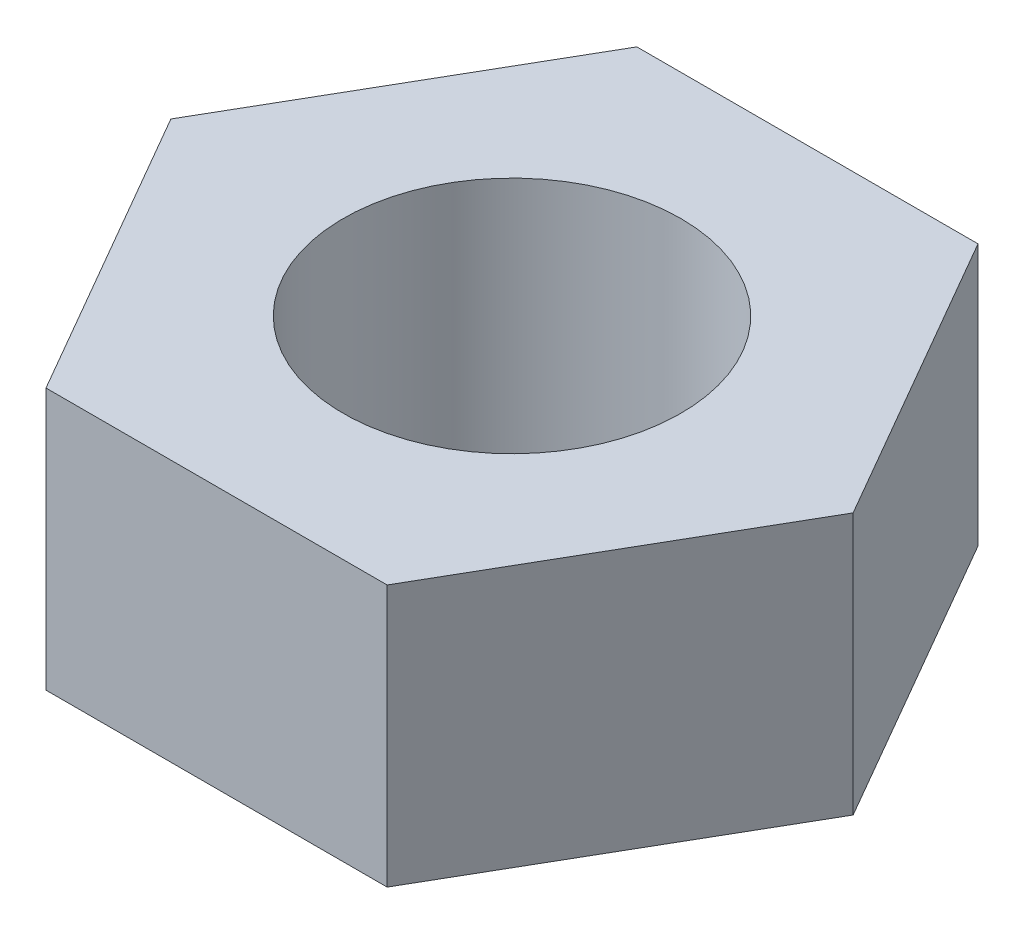
ISO-10303-21;
HEADER;
FILE_DESCRIPTION(('STEP AP214'),'2;1');
FILE_NAME('part.step','',(''),(''),'','','');
FILE_SCHEMA(('AUTOMOTIVE_DESIGN { 1 0 10303 214 1 1 1 1 }'));
ENDSEC;
DATA;
#1=APPLICATION_CONTEXT('core data for automotive mechanical design processes');
#2=APPLICATION_PROTOCOL_DEFINITION('international standard','automotive_design',2000,#1);
#3=PRODUCT_CONTEXT('',#1,'mechanical');
#4=PRODUCT('Part','Part','',(#3));
#5=PRODUCT_RELATED_PRODUCT_CATEGORY('part','',(#4));
#6=PRODUCT_DEFINITION_FORMATION('','',#4);
#7=PRODUCT_DEFINITION_CONTEXT('part definition',#1,'design');
#8=PRODUCT_DEFINITION('design','',#6,#7);
#9=PRODUCT_DEFINITION_SHAPE('','',#8);
#10=(LENGTH_UNIT() NAMED_UNIT(*) SI_UNIT(.MILLI.,.METRE.));
#11=(NAMED_UNIT(*) PLANE_ANGLE_UNIT() SI_UNIT($,.RADIAN.));
#12=(NAMED_UNIT(*) SI_UNIT($,.STERADIAN.) SOLID_ANGLE_UNIT());
#13=UNCERTAINTY_MEASURE_WITH_UNIT(LENGTH_MEASURE(1.E-05),#10,'distance_accuracy_value','');
#14=(GEOMETRIC_REPRESENTATION_CONTEXT(3) GLOBAL_UNCERTAINTY_ASSIGNED_CONTEXT((#13)) GLOBAL_UNIT_ASSIGNED_CONTEXT((#10,
#11,#12)) REPRESENTATION_CONTEXT('',''));
#15=CARTESIAN_POINT('',(0.,0.,0.));
#16=DIRECTION('',(0.,0.,1.));
#17=DIRECTION('',(1.,0.,0.));
#18=AXIS2_PLACEMENT_3D('',#15,#16,#17);
#19=CARTESIAN_POINT('',(2.02072594216369,3.1,3.5));
#20=DIRECTION('',(-0.866025403784439,0.,-0.5));
#21=DIRECTION('',(-0.5,0.,0.866025403784439));
#22=AXIS2_PLACEMENT_3D('',#19,#20,#21);
#23=PLANE('',#22);
#24=DIRECTION('',(0.5,0.,-0.866025403784439));
#25=VECTOR('',#24,1.);
#26=CARTESIAN_POINT('',(2.02072594216369,0.,3.5));
#27=LINE('',#26,#25);
#28=CARTESIAN_POINT('',(2.02072594216369,0.,3.5));
#29=VERTEX_POINT('',#28);
#30=CARTESIAN_POINT('',(4.04145188432738,0.,0.));
#31=VERTEX_POINT('',#30);
#32=EDGE_CURVE('E132',#29,#31,#27,.T.);
#33=ORIENTED_EDGE('',*,*,#32,.T.);
#34=DIRECTION('',(0.,-1.,0.));
#35=VECTOR('',#34,1.);
#36=CARTESIAN_POINT('',(4.04145188432738,3.1,0.));
#37=LINE('',#36,#35);
#38=CARTESIAN_POINT('',(4.04145188432738,3.1,0.));
#39=VERTEX_POINT('',#38);
#40=EDGE_CURVE('E11',#39,#31,#37,.T.);
#41=ORIENTED_EDGE('',*,*,#40,.F.);
#42=DIRECTION('',(0.5,0.,-0.866025403784439));
#43=VECTOR('',#42,1.);
#44=CARTESIAN_POINT('',(2.02072594216369,3.1,3.5));
#45=LINE('',#44,#43);
#46=CARTESIAN_POINT('',(2.02072594216369,3.1,3.5));
#47=VERTEX_POINT('',#46);
#48=EDGE_CURVE('E149',#47,#39,#45,.T.);
#49=ORIENTED_EDGE('',*,*,#48,.F.);
#50=DIRECTION('',(0.,-1.,0.));
#51=VECTOR('',#50,1.);
#52=CARTESIAN_POINT('',(2.02072594216369,3.1,3.5));
#53=LINE('',#52,#51);
#54=EDGE_CURVE('E128',#47,#29,#53,.T.);
#55=ORIENTED_EDGE('',*,*,#54,.T.);
#56=EDGE_LOOP('',(#33,#41,#49,#55));
#57=FACE_BOUND('',#56,.T.);
#58=ADVANCED_FACE('F43',(#57),#23,.F.);
#59=CARTESIAN_POINT('',(4.04145188432738,3.1,0.));
#60=DIRECTION('',(-0.866025403784438,0.,0.5));
#61=DIRECTION('',(0.5,0.,0.866025403784439));
#62=AXIS2_PLACEMENT_3D('',#59,#60,#61);
#63=PLANE('',#62);
#64=DIRECTION('',(-0.5,0.,-0.866025403784438));
#65=VECTOR('',#64,1.);
#66=CARTESIAN_POINT('',(4.04145188432738,0.,0.));
#67=LINE('',#66,#65);
#68=CARTESIAN_POINT('',(2.02072594216369,0.,-3.5));
#69=VERTEX_POINT('',#68);
#70=EDGE_CURVE('E136',#31,#69,#67,.T.);
#71=ORIENTED_EDGE('',*,*,#70,.T.);
#72=DIRECTION('',(0.,-1.,0.));
#73=VECTOR('',#72,1.);
#74=CARTESIAN_POINT('',(2.02072594216369,3.1,-3.5));
#75=LINE('',#74,#73);
#76=CARTESIAN_POINT('',(2.02072594216369,3.1,-3.5));
#77=VERTEX_POINT('',#76);
#78=EDGE_CURVE('E52',#77,#69,#75,.T.);
#79=ORIENTED_EDGE('',*,*,#78,.F.);
#80=DIRECTION('',(-0.5,0.,-0.866025403784438));
#81=VECTOR('',#80,1.);
#82=CARTESIAN_POINT('',(4.04145188432738,3.1,0.));
#83=LINE('',#82,#81);
#84=EDGE_CURVE('E97',#39,#77,#83,.T.);
#85=ORIENTED_EDGE('',*,*,#84,.F.);
#86=ORIENTED_EDGE('',*,*,#40,.T.);
#87=EDGE_LOOP('',(#71,#79,#85,#86));
#88=FACE_BOUND('',#87,.T.);
#89=ADVANCED_FACE('F178',(#88),#63,.F.);
#90=CARTESIAN_POINT('',(2.02072594216369,3.1,-3.5));
#91=DIRECTION('',(0.,0.,1.));
#92=DIRECTION('',(1.,0.,0.));
#93=AXIS2_PLACEMENT_3D('',#90,#91,#92);
#94=PLANE('',#93);
#95=DIRECTION('',(-1.,0.,0.));
#96=VECTOR('',#95,1.);
#97=CARTESIAN_POINT('',(2.02072594216369,0.,-3.5));
#98=LINE('',#97,#96);
#99=CARTESIAN_POINT('',(-2.02072594216369,0.,-3.5));
#100=VERTEX_POINT('',#99);
#101=EDGE_CURVE('E140',#69,#100,#98,.T.);
#102=ORIENTED_EDGE('',*,*,#101,.T.);
#103=DIRECTION('',(0.,-1.,0.));
#104=VECTOR('',#103,1.);
#105=CARTESIAN_POINT('',(-2.02072594216369,3.1,-3.5));
#106=LINE('',#105,#104);
#107=CARTESIAN_POINT('',(-2.02072594216369,3.1,-3.5));
#108=VERTEX_POINT('',#107);
#109=EDGE_CURVE('E121',#108,#100,#106,.T.);
#110=ORIENTED_EDGE('',*,*,#109,.F.);
#111=DIRECTION('',(-1.,0.,0.));
#112=VECTOR('',#111,1.);
#113=CARTESIAN_POINT('',(2.02072594216369,3.1,-3.5));
#114=LINE('',#113,#112);
#115=EDGE_CURVE('E110',#77,#108,#114,.T.);
#116=ORIENTED_EDGE('',*,*,#115,.F.);
#117=ORIENTED_EDGE('',*,*,#78,.T.);
#118=EDGE_LOOP('',(#102,#110,#116,#117));
#119=FACE_BOUND('',#118,.T.);
#120=ADVANCED_FACE('F159',(#119),#94,.F.);
#121=CARTESIAN_POINT('',(-2.02072594216369,3.1,-3.5));
#122=DIRECTION('',(0.866025403784438,0.,0.5));
#123=DIRECTION('',(0.5,0.,-0.866025403784439));
#124=AXIS2_PLACEMENT_3D('',#121,#122,#123);
#125=PLANE('',#124);
#126=DIRECTION('',(-0.5,0.,0.866025403784439));
#127=VECTOR('',#126,1.);
#128=CARTESIAN_POINT('',(-2.02072594216369,0.,-3.5));
#129=LINE('',#128,#127);
#130=CARTESIAN_POINT('',(-4.04145188432738,0.,0.));
#131=VERTEX_POINT('',#130);
#132=EDGE_CURVE('E119',#100,#131,#129,.T.);
#133=ORIENTED_EDGE('',*,*,#132,.T.);
#134=DIRECTION('',(0.,-1.,0.));
#135=VECTOR('',#134,1.);
#136=CARTESIAN_POINT('',(-4.04145188432738,3.1,0.));
#137=LINE('',#136,#135);
#138=CARTESIAN_POINT('',(-4.04145188432738,3.1,0.));
#139=VERTEX_POINT('',#138);
#140=EDGE_CURVE('E116',#139,#131,#137,.T.);
#141=ORIENTED_EDGE('',*,*,#140,.F.);
#142=DIRECTION('',(-0.5,0.,0.866025403784439));
#143=VECTOR('',#142,1.);
#144=CARTESIAN_POINT('',(-2.02072594216369,3.1,-3.5));
#145=LINE('',#144,#143);
#146=EDGE_CURVE('E104',#108,#139,#145,.T.);
#147=ORIENTED_EDGE('',*,*,#146,.F.);
#148=ORIENTED_EDGE('',*,*,#109,.T.);
#149=EDGE_LOOP('',(#133,#141,#147,#148));
#150=FACE_BOUND('',#149,.T.);
#151=ADVANCED_FACE('F117',(#150),#125,.F.);
#152=CARTESIAN_POINT('',(-4.04145188432738,3.1,0.));
#153=DIRECTION('',(0.866025403784438,0.,-0.5));
#154=DIRECTION('',(-0.5,0.,-0.866025403784439));
#155=AXIS2_PLACEMENT_3D('',#152,#153,#154);
#156=PLANE('',#155);
#157=DIRECTION('',(0.5,0.,0.866025403784439));
#158=VECTOR('',#157,1.);
#159=CARTESIAN_POINT('',(-4.04145188432738,0.,0.));
#160=LINE('',#159,#158);
#161=CARTESIAN_POINT('',(-2.02072594216369,0.,3.5));
#162=VERTEX_POINT('',#161);
#163=EDGE_CURVE('E83',#131,#162,#160,.T.);
#164=ORIENTED_EDGE('',*,*,#163,.T.);
#165=DIRECTION('',(0.,-1.,0.));
#166=VECTOR('',#165,1.);
#167=CARTESIAN_POINT('',(-2.02072594216369,3.1,3.5));
#168=LINE('',#167,#166);
#169=CARTESIAN_POINT('',(-2.02072594216369,3.1,3.5));
#170=VERTEX_POINT('',#169);
#171=EDGE_CURVE('E122',#170,#162,#168,.T.);
#172=ORIENTED_EDGE('',*,*,#171,.F.);
#173=DIRECTION('',(0.5,0.,0.866025403784439));
#174=VECTOR('',#173,1.);
#175=CARTESIAN_POINT('',(-4.04145188432738,3.1,0.));
#176=LINE('',#175,#174);
#177=EDGE_CURVE('E108',#139,#170,#176,.T.);
#178=ORIENTED_EDGE('',*,*,#177,.F.);
#179=ORIENTED_EDGE('',*,*,#140,.T.);
#180=EDGE_LOOP('',(#164,#172,#178,#179));
#181=FACE_BOUND('',#180,.T.);
#182=ADVANCED_FACE('F124',(#181),#156,.F.);
#183=CARTESIAN_POINT('',(-2.02072594216369,3.1,3.5));
#184=DIRECTION('',(0.,0.,-1.));
#185=DIRECTION('',(-1.,0.,0.));
#186=AXIS2_PLACEMENT_3D('',#183,#184,#185);
#187=PLANE('',#186);
#188=DIRECTION('',(1.,0.,0.));
#189=VECTOR('',#188,1.);
#190=CARTESIAN_POINT('',(-2.02072594216369,0.,3.5));
#191=LINE('',#190,#189);
#192=EDGE_CURVE('E89',#162,#29,#191,.T.);
#193=ORIENTED_EDGE('',*,*,#192,.T.);
#194=ORIENTED_EDGE('',*,*,#54,.F.);
#195=DIRECTION('',(1.,0.,0.));
#196=VECTOR('',#195,1.);
#197=CARTESIAN_POINT('',(-2.02072594216369,3.1,3.5));
#198=LINE('',#197,#196);
#199=EDGE_CURVE('E60',#170,#47,#198,.T.);
#200=ORIENTED_EDGE('',*,*,#199,.F.);
#201=ORIENTED_EDGE('',*,*,#171,.T.);
#202=EDGE_LOOP('',(#193,#194,#200,#201));
#203=FACE_BOUND('',#202,.T.);
#204=ADVANCED_FACE('F166',(#203),#187,.F.);
#205=CARTESIAN_POINT('',(0.,3.1,0.));
#206=DIRECTION('',(0.,1.,0.));
#207=DIRECTION('',(0.,0.,1.));
#208=AXIS2_PLACEMENT_3D('',#205,#206,#207);
#209=PLANE('',#208);
#210=CARTESIAN_POINT('',(0.,3.1,0.));
#211=DIRECTION('',(0.,-1.,0.));
#212=DIRECTION('',(0.,0.,-1.));
#213=AXIS2_PLACEMENT_3D('',#210,#211,#212);
#214=CIRCLE('',#213,2.);
#215=CARTESIAN_POINT('',(0.,3.1,-2.));
#216=VERTEX_POINT('',#215);
#217=EDGE_CURVE('E137',#216,#216,#214,.T.);
#218=ORIENTED_EDGE('',*,*,#217,.T.);
#219=EDGE_LOOP('',(#218));
#220=FACE_BOUND('',#219,.T.);
#221=ORIENTED_EDGE('',*,*,#48,.T.);
#222=ORIENTED_EDGE('',*,*,#84,.T.);
#223=ORIENTED_EDGE('',*,*,#115,.T.);
#224=ORIENTED_EDGE('',*,*,#146,.T.);
#225=ORIENTED_EDGE('',*,*,#177,.T.);
#226=ORIENTED_EDGE('',*,*,#199,.T.);
#227=EDGE_LOOP('',(#221,#222,#223,#224,#225,#226));
#228=FACE_BOUND('',#227,.T.);
#229=ADVANCED_FACE('F106',(#220,#228),#209,.T.);
#230=CARTESIAN_POINT('',(0.,0.,0.));
#231=DIRECTION('',(0.,1.,0.));
#232=DIRECTION('',(0.,0.,1.));
#233=AXIS2_PLACEMENT_3D('',#230,#231,#232);
#234=PLANE('',#233);
#235=CARTESIAN_POINT('',(0.,0.,0.));
#236=DIRECTION('',(0.,-1.,0.));
#237=DIRECTION('',(0.,0.,-1.));
#238=AXIS2_PLACEMENT_3D('',#235,#236,#237);
#239=CIRCLE('',#238,2.);
#240=CARTESIAN_POINT('',(0.,0.,-2.));
#241=VERTEX_POINT('',#240);
#242=EDGE_CURVE('E265',#241,#241,#239,.T.);
#243=ORIENTED_EDGE('',*,*,#242,.F.);
#244=EDGE_LOOP('',(#243));
#245=FACE_BOUND('',#244,.T.);
#246=ORIENTED_EDGE('',*,*,#32,.F.);
#247=ORIENTED_EDGE('',*,*,#192,.F.);
#248=ORIENTED_EDGE('',*,*,#163,.F.);
#249=ORIENTED_EDGE('',*,*,#132,.F.);
#250=ORIENTED_EDGE('',*,*,#101,.F.);
#251=ORIENTED_EDGE('',*,*,#70,.F.);
#252=EDGE_LOOP('',(#246,#247,#248,#249,#250,#251));
#253=FACE_BOUND('',#252,.T.);
#254=ADVANCED_FACE('F162',(#245,#253),#234,.F.);
#255=CARTESIAN_POINT('',(0.,3.1,0.));
#256=DIRECTION('',(0.,-1.,0.));
#257=DIRECTION('',(0.,0.,-1.));
#258=AXIS2_PLACEMENT_3D('',#255,#256,#257);
#259=CYLINDRICAL_SURFACE('',#258,2.);
#260=CARTESIAN_POINT('',(0.,3.1,-2.));
#261=CARTESIAN_POINT('',(0.,3.06770833333333,-2.));
#262=CARTESIAN_POINT('',(0.,3.03541666666667,-2.));
#263=CARTESIAN_POINT('',(0.,2.97083333333333,-2.));
#264=CARTESIAN_POINT('',(0.,2.93854166666667,-2.));
#265=CARTESIAN_POINT('',(0.,2.87395833333333,-2.));
#266=CARTESIAN_POINT('',(0.,2.84166666666667,-2.));
#267=CARTESIAN_POINT('',(0.,2.77708333333333,-2.));
#268=CARTESIAN_POINT('',(0.,2.74479166666667,-2.));
#269=CARTESIAN_POINT('',(0.,2.68020833333333,-2.));
#270=CARTESIAN_POINT('',(0.,2.64791666666667,-2.));
#271=CARTESIAN_POINT('',(0.,2.58333333333333,-2.));
#272=CARTESIAN_POINT('',(0.,2.55104166666667,-2.));
#273=CARTESIAN_POINT('',(0.,2.48645833333333,-2.));
#274=CARTESIAN_POINT('',(0.,2.45416666666667,-2.));
#275=CARTESIAN_POINT('',(0.,2.38958333333333,-2.));
#276=CARTESIAN_POINT('',(0.,2.35729166666667,-2.));
#277=CARTESIAN_POINT('',(0.,2.29270833333333,-2.));
#278=CARTESIAN_POINT('',(0.,2.26041666666667,-2.));
#279=CARTESIAN_POINT('',(0.,2.19583333333333,-2.));
#280=CARTESIAN_POINT('',(0.,2.16354166666667,-2.));
#281=CARTESIAN_POINT('',(0.,2.09895833333333,-2.));
#282=CARTESIAN_POINT('',(0.,2.06666666666667,-2.));
#283=CARTESIAN_POINT('',(0.,2.00208333333333,-2.));
#284=CARTESIAN_POINT('',(0.,1.96979166666667,-2.));
#285=CARTESIAN_POINT('',(0.,1.90520833333333,-2.));
#286=CARTESIAN_POINT('',(0.,1.87291666666667,-2.));
#287=CARTESIAN_POINT('',(0.,1.80833333333333,-2.));
#288=CARTESIAN_POINT('',(0.,1.77604166666667,-2.));
#289=CARTESIAN_POINT('',(0.,1.71145833333333,-2.));
#290=CARTESIAN_POINT('',(0.,1.67916666666667,-2.));
#291=CARTESIAN_POINT('',(0.,1.61458333333333,-2.));
#292=CARTESIAN_POINT('',(0.,1.58229166666667,-2.));
#293=CARTESIAN_POINT('',(0.,1.51770833333333,-2.));
#294=CARTESIAN_POINT('',(0.,1.48541666666667,-2.));
#295=CARTESIAN_POINT('',(0.,1.42083333333333,-2.));
#296=CARTESIAN_POINT('',(0.,1.38854166666667,-2.));
#297=CARTESIAN_POINT('',(0.,1.32395833333333,-2.));
#298=CARTESIAN_POINT('',(0.,1.29166666666667,-2.));
#299=CARTESIAN_POINT('',(0.,1.22708333333333,-2.));
#300=CARTESIAN_POINT('',(0.,1.19479166666667,-2.));
#301=CARTESIAN_POINT('',(0.,1.13020833333333,-2.));
#302=CARTESIAN_POINT('',(0.,1.09791666666667,-2.));
#303=CARTESIAN_POINT('',(0.,1.03333333333333,-2.));
#304=CARTESIAN_POINT('',(0.,1.00104166666667,-2.));
#305=CARTESIAN_POINT('',(0.,0.936458333333333,-2.));
#306=CARTESIAN_POINT('',(0.,0.904166666666667,-2.));
#307=CARTESIAN_POINT('',(0.,0.839583333333334,-2.));
#308=CARTESIAN_POINT('',(0.,0.807291666666667,-2.));
#309=CARTESIAN_POINT('',(0.,0.742708333333333,-2.));
#310=CARTESIAN_POINT('',(0.,0.710416666666667,-2.));
#311=CARTESIAN_POINT('',(0.,0.645833333333333,-2.));
#312=CARTESIAN_POINT('',(0.,0.613541666666667,-2.));
#313=CARTESIAN_POINT('',(0.,0.548958333333333,-2.));
#314=CARTESIAN_POINT('',(0.,0.516666666666667,-2.));
#315=CARTESIAN_POINT('',(0.,0.452083333333333,-2.));
#316=CARTESIAN_POINT('',(0.,0.419791666666667,-2.));
#317=CARTESIAN_POINT('',(0.,0.355208333333333,-2.));
#318=CARTESIAN_POINT('',(0.,0.322916666666667,-2.));
#319=CARTESIAN_POINT('',(0.,0.258333333333333,-2.));
#320=CARTESIAN_POINT('',(0.,0.226041666666667,-2.));
#321=CARTESIAN_POINT('',(0.,0.161458333333333,-2.));
#322=CARTESIAN_POINT('',(0.,0.129166666666667,-2.));
#323=CARTESIAN_POINT('',(0.,0.0645833333333335,-2.));
#324=CARTESIAN_POINT('',(0.,0.0322916666666667,-2.));
#325=CARTESIAN_POINT('',(0.,0.,-2.));
#326=B_SPLINE_CURVE_WITH_KNOTS('',3,(#260,#261,#262,#263,#264,#265,#266,#267,#268,#269,#270,
#271,#272,#273,#274,#275,#276,#277,#278,#279,#280,#281,#282,#283,#284,#285,#286,#287,#288,#289,
#290,#291,#292,#293,#294,#295,#296,#297,#298,#299,#300,#301,#302,#303,#304,#305,#306,#307,#308,
#309,#310,#311,#312,#313,#314,#315,#316,#317,#318,#319,#320,#321,#322,#323,#324,#325),
.UNSPECIFIED.,.F.,.F.,(4,2,2,2,2,2,2,2,2,2,2,2,2,2,2,2,2,2,2,2,2,2,2,2,2,2,2,2,2,2,2,2,4),(0.,
0.0968749999999997,0.19375,0.290625,0.3875,0.484375,0.58125,0.678125,0.775,0.871875,0.96875,
1.065625,1.1625,1.259375,1.35625,1.453125,1.55,1.646875,1.74375,1.840625,1.9375,2.034375,
2.13125,2.228125,2.325,2.421875,2.51875,2.615625,2.7125,2.809375,2.90625,3.003125,3.1),.UNSPECIFIED.);
#327=EDGE_CURVE('BSEAM218',#216,#241,#326,.T.);
#328=ORIENTED_EDGE('',*,*,#217,.F.);
#329=ORIENTED_EDGE('',*,*,#242,.T.);
#330=ORIENTED_EDGE('',*,*,#327,.T.);
#331=ORIENTED_EDGE('',*,*,#327,.F.);
#332=EDGE_LOOP('',(#328,#330,#329,#331));
#333=FACE_BOUND('',#332,.T.);
#334=ADVANCED_FACE('F218',(#333),#259,.F.);
#335=CLOSED_SHELL('',(#58,#89,#120,#151,#182,#204,#229,#254,#334));
#336=MANIFOLD_SOLID_BREP('B2',#335);
#337=ADVANCED_BREP_SHAPE_REPRESENTATION('',(#18,#336),#14);
#338=SHAPE_DEFINITION_REPRESENTATION(#9,#337);
ENDSEC;
END-ISO-10303-21;
